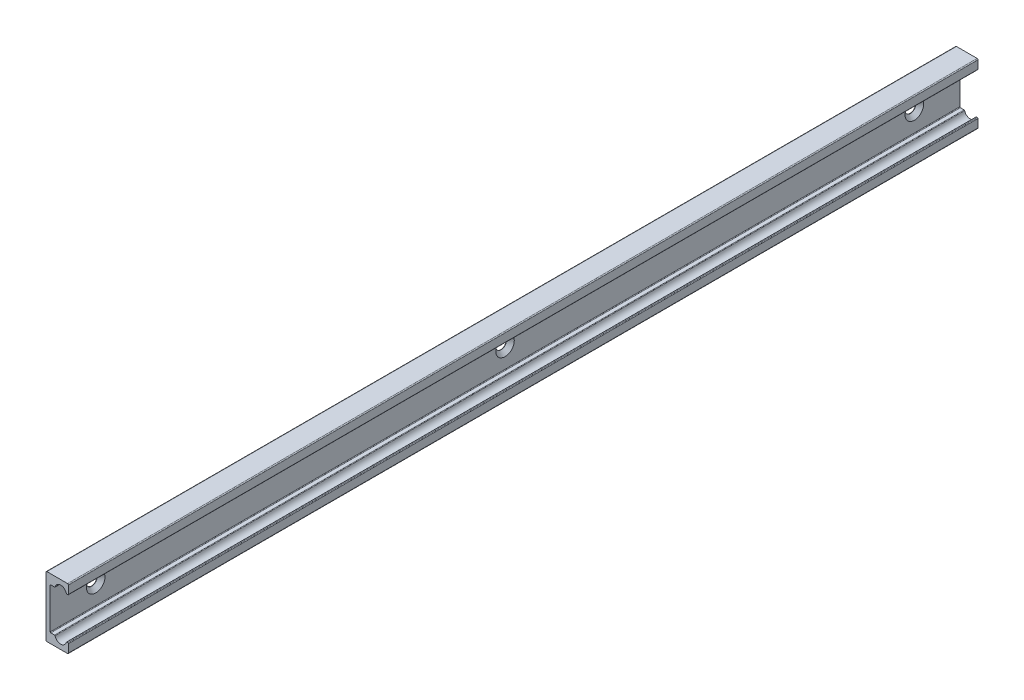
ISO-10303-21;
HEADER;
FILE_DESCRIPTION(('STEP AP214'),'2;1');
FILE_NAME('part.step','',(''),(''),'','','');
FILE_SCHEMA(('AUTOMOTIVE_DESIGN { 1 0 10303 214 1 1 1 1 }'));
ENDSEC;
DATA;
#1=APPLICATION_CONTEXT('core data for automotive mechanical design processes');
#2=APPLICATION_PROTOCOL_DEFINITION('international standard','automotive_design',2000,#1);
#3=PRODUCT_CONTEXT('',#1,'mechanical');
#4=PRODUCT('Part','Part','',(#3));
#5=PRODUCT_RELATED_PRODUCT_CATEGORY('part','',(#4));
#6=PRODUCT_DEFINITION_FORMATION('','',#4);
#7=PRODUCT_DEFINITION_CONTEXT('part definition',#1,'design');
#8=PRODUCT_DEFINITION('design','',#6,#7);
#9=PRODUCT_DEFINITION_SHAPE('','',#8);
#10=(LENGTH_UNIT() NAMED_UNIT(*) SI_UNIT(.MILLI.,.METRE.));
#11=(NAMED_UNIT(*) PLANE_ANGLE_UNIT() SI_UNIT($,.RADIAN.));
#12=(NAMED_UNIT(*) SI_UNIT($,.STERADIAN.) SOLID_ANGLE_UNIT());
#13=UNCERTAINTY_MEASURE_WITH_UNIT(LENGTH_MEASURE(1.E-05),#10,'distance_accuracy_value','');
#14=(GEOMETRIC_REPRESENTATION_CONTEXT(3) GLOBAL_UNCERTAINTY_ASSIGNED_CONTEXT((#13)) GLOBAL_UNIT_ASSIGNED_CONTEXT((#10,
#11,#12)) REPRESENTATION_CONTEXT('',''));
#15=CARTESIAN_POINT('',(0.,0.,0.));
#16=DIRECTION('',(0.,0.,1.));
#17=DIRECTION('',(1.,0.,0.));
#18=AXIS2_PLACEMENT_3D('',#15,#16,#17);
#19=CARTESIAN_POINT('',(-7.1,19.7,300.));
#20=DIRECTION('',(0.,0.,-1.));
#21=DIRECTION('',(-1.,0.,0.));
#22=AXIS2_PLACEMENT_3D('',#19,#20,#21);
#23=CYLINDRICAL_SURFACE('',#22,0.299999999999998);
#24=CARTESIAN_POINT('',(-7.1,19.7,0.));
#25=DIRECTION('',(0.,0.,1.));
#26=DIRECTION('',(1.,0.,0.));
#27=AXIS2_PLACEMENT_3D('',#24,#25,#26);
#28=CIRCLE('',#27,0.299999999999998);
#29=CARTESIAN_POINT('',(-7.1,20.,0.));
#30=VERTEX_POINT('',#29);
#31=CARTESIAN_POINT('',(-7.4,19.7,0.));
#32=VERTEX_POINT('',#31);
#33=EDGE_CURVE('E209',#30,#32,#28,.T.);
#34=ORIENTED_EDGE('',*,*,#33,.T.);
#35=DIRECTION('',(0.,0.,-1.));
#36=VECTOR('',#35,1.);
#37=CARTESIAN_POINT('',(-7.4,19.7,300.));
#38=LINE('',#37,#36);
#39=CARTESIAN_POINT('',(-7.4,19.7,300.));
#40=VERTEX_POINT('',#39);
#41=EDGE_CURVE('E11',#40,#32,#38,.T.);
#42=ORIENTED_EDGE('',*,*,#41,.F.);
#43=CARTESIAN_POINT('',(-7.1,19.7,300.));
#44=DIRECTION('',(0.,0.,1.));
#45=DIRECTION('',(1.,0.,0.));
#46=AXIS2_PLACEMENT_3D('',#43,#44,#45);
#47=CIRCLE('',#46,0.299999999999998);
#48=CARTESIAN_POINT('',(-7.1,20.,300.));
#49=VERTEX_POINT('',#48);
#50=EDGE_CURVE('E264',#49,#40,#47,.T.);
#51=ORIENTED_EDGE('',*,*,#50,.F.);
#52=DIRECTION('',(0.,0.,-1.));
#53=VECTOR('',#52,1.);
#54=CARTESIAN_POINT('',(-7.1,20.,300.));
#55=LINE('',#54,#53);
#56=EDGE_CURVE('E205',#49,#30,#55,.T.);
#57=ORIENTED_EDGE('',*,*,#56,.T.);
#58=EDGE_LOOP('',(#34,#42,#51,#57));
#59=FACE_BOUND('',#58,.T.);
#60=ADVANCED_FACE('F17',(#59),#23,.T.);
#61=CARTESIAN_POINT('',(-7.4,19.7,300.));
#62=DIRECTION('',(1.,0.,0.));
#63=DIRECTION('',(0.,0.,-1.));
#64=AXIS2_PLACEMENT_3D('',#61,#62,#63);
#65=PLANE('',#64);
#66=CARTESIAN_POINT('',(-7.4,10.,150.));
#67=DIRECTION('',(1.,0.,0.));
#68=DIRECTION('',(0.,0.,-1.));
#69=AXIS2_PLACEMENT_3D('',#66,#67,#68);
#70=CIRCLE('',#69,1.75);
#71=CARTESIAN_POINT('',(-7.4,10.,148.25));
#72=VERTEX_POINT('',#71);
#73=EDGE_CURVE('E581',#72,#72,#70,.T.);
#74=ORIENTED_EDGE('',*,*,#73,.T.);
#75=EDGE_LOOP('',(#74));
#76=FACE_BOUND('',#75,.T.);
#77=CARTESIAN_POINT('',(-7.4,10.,285.));
#78=DIRECTION('',(1.,0.,0.));
#79=DIRECTION('',(0.,0.,-1.));
#80=AXIS2_PLACEMENT_3D('',#77,#78,#79);
#81=CIRCLE('',#80,1.75);
#82=CARTESIAN_POINT('',(-7.4,10.,283.25));
#83=VERTEX_POINT('',#82);
#84=EDGE_CURVE('E585',#83,#83,#81,.T.);
#85=ORIENTED_EDGE('',*,*,#84,.T.);
#86=EDGE_LOOP('',(#85));
#87=FACE_BOUND('',#86,.T.);
#88=CARTESIAN_POINT('',(-7.4,10.,15.));
#89=DIRECTION('',(1.,0.,0.));
#90=DIRECTION('',(0.,0.,-1.));
#91=AXIS2_PLACEMENT_3D('',#88,#89,#90);
#92=CIRCLE('',#91,1.75);
#93=CARTESIAN_POINT('',(-7.4,10.,13.25));
#94=VERTEX_POINT('',#93);
#95=EDGE_CURVE('E213',#94,#94,#92,.T.);
#96=ORIENTED_EDGE('',*,*,#95,.T.);
#97=EDGE_LOOP('',(#96));
#98=FACE_BOUND('',#97,.T.);
#99=DIRECTION('',(0.,-1.,0.));
#100=VECTOR('',#99,1.);
#101=CARTESIAN_POINT('',(-7.4,19.7,0.));
#102=LINE('',#101,#100);
#103=CARTESIAN_POINT('',(-7.4,0.300000000000002,0.));
#104=VERTEX_POINT('',#103);
#105=EDGE_CURVE('E212',#32,#104,#102,.T.);
#106=ORIENTED_EDGE('',*,*,#105,.T.);
#107=DIRECTION('',(0.,0.,-1.));
#108=VECTOR('',#107,1.);
#109=CARTESIAN_POINT('',(-7.4,0.300000000000002,300.));
#110=LINE('',#109,#108);
#111=CARTESIAN_POINT('',(-7.4,0.300000000000002,300.));
#112=VERTEX_POINT('',#111);
#113=EDGE_CURVE('E25',#112,#104,#110,.T.);
#114=ORIENTED_EDGE('',*,*,#113,.F.);
#115=DIRECTION('',(0.,-1.,0.));
#116=VECTOR('',#115,1.);
#117=CARTESIAN_POINT('',(-7.4,19.7,300.));
#118=LINE('',#117,#116);
#119=EDGE_CURVE('E124',#40,#112,#118,.T.);
#120=ORIENTED_EDGE('',*,*,#119,.F.);
#121=ORIENTED_EDGE('',*,*,#41,.T.);
#122=EDGE_LOOP('',(#106,#114,#120,#121));
#123=FACE_BOUND('',#122,.T.);
#124=ADVANCED_FACE('F400',(#76,#87,#98,#123),#65,.F.);
#125=CARTESIAN_POINT('',(-7.1,0.299999999999999,300.));
#126=DIRECTION('',(0.,0.,-1.));
#127=DIRECTION('',(-1.,0.,0.));
#128=AXIS2_PLACEMENT_3D('',#125,#126,#127);
#129=CYLINDRICAL_SURFACE('',#128,0.299999999999999);
#130=CARTESIAN_POINT('',(-7.1,0.299999999999999,0.));
#131=DIRECTION('',(0.,0.,1.));
#132=DIRECTION('',(1.,0.,0.));
#133=AXIS2_PLACEMENT_3D('',#130,#131,#132);
#134=CIRCLE('',#133,0.299999999999999);
#135=CARTESIAN_POINT('',(-7.1,0.,0.));
#136=VERTEX_POINT('',#135);
#137=EDGE_CURVE('E215',#104,#136,#134,.T.);
#138=ORIENTED_EDGE('',*,*,#137,.T.);
#139=DIRECTION('',(0.,0.,-1.));
#140=VECTOR('',#139,1.);
#141=CARTESIAN_POINT('',(-7.1,0.,300.));
#142=LINE('',#141,#140);
#143=CARTESIAN_POINT('',(-7.1,0.,300.));
#144=VERTEX_POINT('',#143);
#145=EDGE_CURVE('E311',#144,#136,#142,.T.);
#146=ORIENTED_EDGE('',*,*,#145,.F.);
#147=CARTESIAN_POINT('',(-7.1,0.299999999999999,300.));
#148=DIRECTION('',(0.,0.,1.));
#149=DIRECTION('',(1.,0.,0.));
#150=AXIS2_PLACEMENT_3D('',#147,#148,#149);
#151=CIRCLE('',#150,0.299999999999999);
#152=EDGE_CURVE('E319',#112,#144,#151,.T.);
#153=ORIENTED_EDGE('',*,*,#152,.F.);
#154=ORIENTED_EDGE('',*,*,#113,.T.);
#155=EDGE_LOOP('',(#138,#146,#153,#154));
#156=FACE_BOUND('',#155,.T.);
#157=ADVANCED_FACE('F317',(#156),#129,.T.);
#158=CARTESIAN_POINT('',(-7.1,0.,300.));
#159=DIRECTION('',(0.,1.,0.));
#160=DIRECTION('',(0.,0.,1.));
#161=AXIS2_PLACEMENT_3D('',#158,#159,#160);
#162=PLANE('',#161);
#163=DIRECTION('',(1.,0.,0.));
#164=VECTOR('',#163,1.);
#165=CARTESIAN_POINT('',(-7.1,0.,0.));
#166=LINE('',#165,#164);
#167=CARTESIAN_POINT('',(-0.300000000000001,0.,0.));
#168=VERTEX_POINT('',#167);
#169=EDGE_CURVE('E217',#136,#168,#166,.T.);
#170=ORIENTED_EDGE('',*,*,#169,.T.);
#171=DIRECTION('',(0.,0.,-1.));
#172=VECTOR('',#171,1.);
#173=CARTESIAN_POINT('',(-0.300000000000001,0.,300.));
#174=LINE('',#173,#172);
#175=CARTESIAN_POINT('',(-0.300000000000001,0.,300.));
#176=VERTEX_POINT('',#175);
#177=EDGE_CURVE('E308',#176,#168,#174,.T.);
#178=ORIENTED_EDGE('',*,*,#177,.F.);
#179=DIRECTION('',(1.,0.,0.));
#180=VECTOR('',#179,1.);
#181=CARTESIAN_POINT('',(-7.1,0.,300.));
#182=LINE('',#181,#180);
#183=EDGE_CURVE('E337',#144,#176,#182,.T.);
#184=ORIENTED_EDGE('',*,*,#183,.F.);
#185=ORIENTED_EDGE('',*,*,#145,.T.);
#186=EDGE_LOOP('',(#170,#178,#184,#185));
#187=FACE_BOUND('',#186,.T.);
#188=ADVANCED_FACE('F328',(#187),#162,.F.);
#189=CARTESIAN_POINT('',(-0.3,0.3,300.));
#190=DIRECTION('',(0.,0.,-1.));
#191=DIRECTION('',(-1.,0.,0.));
#192=AXIS2_PLACEMENT_3D('',#189,#190,#191);
#193=CYLINDRICAL_SURFACE('',#192,0.3);
#194=CARTESIAN_POINT('',(-0.3,0.3,0.));
#195=DIRECTION('',(0.,0.,1.));
#196=DIRECTION('',(1.,0.,0.));
#197=AXIS2_PLACEMENT_3D('',#194,#195,#196);
#198=CIRCLE('',#197,0.3);
#199=CARTESIAN_POINT('',(0.,0.3,0.));
#200=VERTEX_POINT('',#199);
#201=EDGE_CURVE('E219',#168,#200,#198,.T.);
#202=ORIENTED_EDGE('',*,*,#201,.T.);
#203=DIRECTION('',(0.,0.,-1.));
#204=VECTOR('',#203,1.);
#205=CARTESIAN_POINT('',(0.,0.3,300.));
#206=LINE('',#205,#204);
#207=CARTESIAN_POINT('',(0.,0.3,300.));
#208=VERTEX_POINT('',#207);
#209=EDGE_CURVE('E305',#208,#200,#206,.T.);
#210=ORIENTED_EDGE('',*,*,#209,.F.);
#211=CARTESIAN_POINT('',(-0.3,0.3,300.));
#212=DIRECTION('',(0.,0.,1.));
#213=DIRECTION('',(1.,0.,0.));
#214=AXIS2_PLACEMENT_3D('',#211,#212,#213);
#215=CIRCLE('',#214,0.3);
#216=EDGE_CURVE('E334',#176,#208,#215,.T.);
#217=ORIENTED_EDGE('',*,*,#216,.F.);
#218=ORIENTED_EDGE('',*,*,#177,.T.);
#219=EDGE_LOOP('',(#202,#210,#217,#218));
#220=FACE_BOUND('',#219,.T.);
#221=ADVANCED_FACE('F332',(#220),#193,.T.);
#222=CARTESIAN_POINT('',(0.,0.3,300.));
#223=DIRECTION('',(-1.,0.,0.));
#224=DIRECTION('',(0.,0.,1.));
#225=AXIS2_PLACEMENT_3D('',#222,#223,#224);
#226=PLANE('',#225);
#227=DIRECTION('',(0.,1.,0.));
#228=VECTOR('',#227,1.);
#229=CARTESIAN_POINT('',(0.,0.3,0.));
#230=LINE('',#229,#228);
#231=CARTESIAN_POINT('',(0.,2.95,0.));
#232=VERTEX_POINT('',#231);
#233=EDGE_CURVE('E221',#200,#232,#230,.T.);
#234=ORIENTED_EDGE('',*,*,#233,.T.);
#235=DIRECTION('',(0.,0.,-1.));
#236=VECTOR('',#235,1.);
#237=CARTESIAN_POINT('',(0.,2.95,300.));
#238=LINE('',#237,#236);
#239=CARTESIAN_POINT('',(0.,2.95,300.));
#240=VERTEX_POINT('',#239);
#241=EDGE_CURVE('E302',#240,#232,#238,.T.);
#242=ORIENTED_EDGE('',*,*,#241,.F.);
#243=DIRECTION('',(0.,1.,0.));
#244=VECTOR('',#243,1.);
#245=CARTESIAN_POINT('',(0.,0.3,300.));
#246=LINE('',#245,#244);
#247=EDGE_CURVE('E336',#208,#240,#246,.T.);
#248=ORIENTED_EDGE('',*,*,#247,.F.);
#249=ORIENTED_EDGE('',*,*,#209,.T.);
#250=EDGE_LOOP('',(#234,#242,#248,#249));
#251=FACE_BOUND('',#250,.T.);
#252=ADVANCED_FACE('F416',(#251),#226,.F.);
#253=CARTESIAN_POINT('',(-0.199999999999999,2.95,300.));
#254=DIRECTION('',(0.,0.,-1.));
#255=DIRECTION('',(-1.,0.,0.));
#256=AXIS2_PLACEMENT_3D('',#253,#254,#255);
#257=CYLINDRICAL_SURFACE('',#256,0.199999999999999);
#258=CARTESIAN_POINT('',(-0.199999999999999,2.95,0.));
#259=DIRECTION('',(0.,0.,1.));
#260=DIRECTION('',(1.,0.,0.));
#261=AXIS2_PLACEMENT_3D('',#258,#259,#260);
#262=CIRCLE('',#261,0.199999999999999);
#263=CARTESIAN_POINT('',(-0.2,3.15,0.));
#264=VERTEX_POINT('',#263);
#265=EDGE_CURVE('E223',#232,#264,#262,.T.);
#266=ORIENTED_EDGE('',*,*,#265,.T.);
#267=DIRECTION('',(0.,0.,-1.));
#268=VECTOR('',#267,1.);
#269=CARTESIAN_POINT('',(-0.2,3.15,300.));
#270=LINE('',#269,#268);
#271=CARTESIAN_POINT('',(-0.2,3.15,300.));
#272=VERTEX_POINT('',#271);
#273=EDGE_CURVE('E299',#272,#264,#270,.T.);
#274=ORIENTED_EDGE('',*,*,#273,.F.);
#275=CARTESIAN_POINT('',(-0.199999999999999,2.95,300.));
#276=DIRECTION('',(0.,0.,1.));
#277=DIRECTION('',(1.,0.,0.));
#278=AXIS2_PLACEMENT_3D('',#275,#276,#277);
#279=CIRCLE('',#278,0.199999999999999);
#280=EDGE_CURVE('E339',#240,#272,#279,.T.);
#281=ORIENTED_EDGE('',*,*,#280,.F.);
#282=ORIENTED_EDGE('',*,*,#241,.T.);
#283=EDGE_LOOP('',(#266,#274,#281,#282));
#284=FACE_BOUND('',#283,.T.);
#285=ADVANCED_FACE('F419',(#284),#257,.T.);
#286=CARTESIAN_POINT('',(-0.2,3.15,300.));
#287=DIRECTION('',(0.,-1.,0.));
#288=DIRECTION('',(0.,0.,-1.));
#289=AXIS2_PLACEMENT_3D('',#286,#287,#288);
#290=PLANE('',#289);
#291=DIRECTION('',(-1.,0.,0.));
#292=VECTOR('',#291,1.);
#293=CARTESIAN_POINT('',(-0.2,3.15,0.));
#294=LINE('',#293,#292);
#295=CARTESIAN_POINT('',(-0.514127950975306,3.15,0.));
#296=VERTEX_POINT('',#295);
#297=EDGE_CURVE('E225',#264,#296,#294,.T.);
#298=ORIENTED_EDGE('',*,*,#297,.T.);
#299=DIRECTION('',(0.,0.,-1.));
#300=VECTOR('',#299,1.);
#301=CARTESIAN_POINT('',(-0.514127950975306,3.15,300.));
#302=LINE('',#301,#300);
#303=CARTESIAN_POINT('',(-0.514127950975306,3.15,300.));
#304=VERTEX_POINT('',#303);
#305=EDGE_CURVE('E296',#304,#296,#302,.T.);
#306=ORIENTED_EDGE('',*,*,#305,.F.);
#307=DIRECTION('',(-1.,0.,0.));
#308=VECTOR('',#307,1.);
#309=CARTESIAN_POINT('',(-0.2,3.15,300.));
#310=LINE('',#309,#308);
#311=EDGE_CURVE('E345',#272,#304,#310,.T.);
#312=ORIENTED_EDGE('',*,*,#311,.F.);
#313=ORIENTED_EDGE('',*,*,#273,.T.);
#314=EDGE_LOOP('',(#298,#306,#312,#313));
#315=FACE_BOUND('',#314,.T.);
#316=ADVANCED_FACE('F423',(#315),#290,.F.);
#317=CARTESIAN_POINT('',(-0.514127950975306,2.95,300.));
#318=DIRECTION('',(0.,0.,-1.));
#319=DIRECTION('',(-1.,0.,0.));
#320=AXIS2_PLACEMENT_3D('',#317,#318,#319);
#321=CYLINDRICAL_SURFACE('',#320,0.2);
#322=CARTESIAN_POINT('',(-0.514127950975306,2.95,0.));
#323=DIRECTION('',(0.,0.,1.));
#324=DIRECTION('',(1.,0.,0.));
#325=AXIS2_PLACEMENT_3D('',#322,#323,#324);
#326=CIRCLE('',#325,0.2);
#327=CARTESIAN_POINT('',(-0.708020527072896,2.99904761904762,0.));
#328=VERTEX_POINT('',#327);
#329=EDGE_CURVE('E227',#296,#328,#326,.T.);
#330=ORIENTED_EDGE('',*,*,#329,.T.);
#331=DIRECTION('',(0.,0.,-1.));
#332=VECTOR('',#331,1.);
#333=CARTESIAN_POINT('',(-0.708020527072896,2.99904761904762,300.));
#334=LINE('',#333,#332);
#335=CARTESIAN_POINT('',(-0.708020527072896,2.99904761904762,300.));
#336=VERTEX_POINT('',#335);
#337=EDGE_CURVE('E294',#336,#328,#334,.T.);
#338=ORIENTED_EDGE('',*,*,#337,.F.);
#339=CARTESIAN_POINT('',(-0.514127950975306,2.95,300.));
#340=DIRECTION('',(0.,0.,1.));
#341=DIRECTION('',(1.,0.,0.));
#342=AXIS2_PLACEMENT_3D('',#339,#340,#341);
#343=CIRCLE('',#342,0.2);
#344=EDGE_CURVE('E347',#304,#336,#343,.T.);
#345=ORIENTED_EDGE('',*,*,#344,.F.);
#346=ORIENTED_EDGE('',*,*,#305,.T.);
#347=EDGE_LOOP('',(#330,#338,#345,#346));
#348=FACE_BOUND('',#347,.T.);
#349=ADVANCED_FACE('F427',(#348),#321,.T.);
#350=CARTESIAN_POINT('',(-2.55,3.46499999999999,300.));
#351=DIRECTION('',(0.,0.,-1.));
#352=DIRECTION('',(-1.,0.,0.));
#353=AXIS2_PLACEMENT_3D('',#350,#351,#352);
#354=CYLINDRICAL_SURFACE('',#353,1.9);
#355=CARTESIAN_POINT('',(-2.55,3.46499999999999,0.));
#356=DIRECTION('',(0.,0.,1.));
#357=DIRECTION('',(1.,0.,0.));
#358=AXIS2_PLACEMENT_3D('',#355,#356,#357);
#359=CIRCLE('',#358,1.9);
#360=CARTESIAN_POINT('',(-4.3919794729271,2.99904761904762,0.));
#361=VERTEX_POINT('',#360);
#362=EDGE_CURVE('E230',#361,#328,#359,.T.);
#363=ORIENTED_EDGE('',*,*,#362,.F.);
#364=DIRECTION('',(0.,0.,-1.));
#365=VECTOR('',#364,1.);
#366=CARTESIAN_POINT('',(-4.3919794729271,2.99904761904762,300.));
#367=LINE('',#366,#365);
#368=CARTESIAN_POINT('',(-4.3919794729271,2.99904761904762,300.));
#369=VERTEX_POINT('',#368);
#370=EDGE_CURVE('E292',#369,#361,#367,.T.);
#371=ORIENTED_EDGE('',*,*,#370,.F.);
#372=CARTESIAN_POINT('',(-2.55,3.46499999999999,300.));
#373=DIRECTION('',(0.,0.,1.));
#374=DIRECTION('',(1.,0.,0.));
#375=AXIS2_PLACEMENT_3D('',#372,#373,#374);
#376=CIRCLE('',#375,1.9);
#377=EDGE_CURVE('E349',#369,#336,#376,.T.);
#378=ORIENTED_EDGE('',*,*,#377,.T.);
#379=ORIENTED_EDGE('',*,*,#337,.T.);
#380=EDGE_LOOP('',(#363,#371,#378,#379));
#381=FACE_BOUND('',#380,.T.);
#382=ADVANCED_FACE('F431',(#381),#354,.F.);
#383=CARTESIAN_POINT('',(-4.58587204902469,2.95,300.));
#384=DIRECTION('',(0.,0.,-1.));
#385=DIRECTION('',(-1.,0.,0.));
#386=AXIS2_PLACEMENT_3D('',#383,#384,#385);
#387=CYLINDRICAL_SURFACE('',#386,0.2);
#388=CARTESIAN_POINT('',(-4.58587204902469,2.95,0.));
#389=DIRECTION('',(0.,0.,1.));
#390=DIRECTION('',(1.,0.,0.));
#391=AXIS2_PLACEMENT_3D('',#388,#389,#390);
#392=CIRCLE('',#391,0.2);
#393=CARTESIAN_POINT('',(-4.58587204902469,3.15,0.));
#394=VERTEX_POINT('',#393);
#395=EDGE_CURVE('E233',#361,#394,#392,.T.);
#396=ORIENTED_EDGE('',*,*,#395,.T.);
#397=DIRECTION('',(0.,0.,-1.));
#398=VECTOR('',#397,1.);
#399=CARTESIAN_POINT('',(-4.58587204902469,3.15,300.));
#400=LINE('',#399,#398);
#401=CARTESIAN_POINT('',(-4.58587204902469,3.15,300.));
#402=VERTEX_POINT('',#401);
#403=EDGE_CURVE('E289',#402,#394,#400,.T.);
#404=ORIENTED_EDGE('',*,*,#403,.F.);
#405=CARTESIAN_POINT('',(-4.58587204902469,2.95,300.));
#406=DIRECTION('',(0.,0.,1.));
#407=DIRECTION('',(1.,0.,0.));
#408=AXIS2_PLACEMENT_3D('',#405,#406,#407);
#409=CIRCLE('',#408,0.2);
#410=EDGE_CURVE('E352',#369,#402,#409,.T.);
#411=ORIENTED_EDGE('',*,*,#410,.F.);
#412=ORIENTED_EDGE('',*,*,#370,.T.);
#413=EDGE_LOOP('',(#396,#404,#411,#412));
#414=FACE_BOUND('',#413,.T.);
#415=ADVANCED_FACE('F435',(#414),#387,.T.);
#416=CARTESIAN_POINT('',(-4.58587204902469,3.15,300.));
#417=DIRECTION('',(0.,-1.,0.));
#418=DIRECTION('',(0.,0.,-1.));
#419=AXIS2_PLACEMENT_3D('',#416,#417,#418);
#420=PLANE('',#419);
#421=DIRECTION('',(-1.,0.,0.));
#422=VECTOR('',#421,1.);
#423=CARTESIAN_POINT('',(-4.58587204902469,3.15,0.));
#424=LINE('',#423,#422);
#425=CARTESIAN_POINT('',(-5.8,3.15,0.));
#426=VERTEX_POINT('',#425);
#427=EDGE_CURVE('E235',#394,#426,#424,.T.);
#428=ORIENTED_EDGE('',*,*,#427,.T.);
#429=DIRECTION('',(0.,0.,-1.));
#430=VECTOR('',#429,1.);
#431=CARTESIAN_POINT('',(-5.8,3.15,300.));
#432=LINE('',#431,#430);
#433=CARTESIAN_POINT('',(-5.8,3.15,300.));
#434=VERTEX_POINT('',#433);
#435=EDGE_CURVE('E287',#434,#426,#432,.T.);
#436=ORIENTED_EDGE('',*,*,#435,.F.);
#437=DIRECTION('',(-1.,0.,0.));
#438=VECTOR('',#437,1.);
#439=CARTESIAN_POINT('',(-4.58587204902469,3.15,300.));
#440=LINE('',#439,#438);
#441=EDGE_CURVE('E354',#402,#434,#440,.T.);
#442=ORIENTED_EDGE('',*,*,#441,.F.);
#443=ORIENTED_EDGE('',*,*,#403,.T.);
#444=EDGE_LOOP('',(#428,#436,#442,#443));
#445=FACE_BOUND('',#444,.T.);
#446=ADVANCED_FACE('F439',(#445),#420,.F.);
#447=CARTESIAN_POINT('',(-5.8,3.35,300.));
#448=DIRECTION('',(0.,0.,-1.));
#449=DIRECTION('',(-1.,0.,0.));
#450=AXIS2_PLACEMENT_3D('',#447,#448,#449);
#451=CYLINDRICAL_SURFACE('',#450,0.2);
#452=CARTESIAN_POINT('',(-5.8,3.35,0.));
#453=DIRECTION('',(0.,0.,1.));
#454=DIRECTION('',(1.,0.,0.));
#455=AXIS2_PLACEMENT_3D('',#452,#453,#454);
#456=CIRCLE('',#455,0.2);
#457=CARTESIAN_POINT('',(-6.,3.35,0.));
#458=VERTEX_POINT('',#457);
#459=EDGE_CURVE('E238',#458,#426,#456,.T.);
#460=ORIENTED_EDGE('',*,*,#459,.F.);
#461=DIRECTION('',(0.,0.,-1.));
#462=VECTOR('',#461,1.);
#463=CARTESIAN_POINT('',(-6.,3.35,300.));
#464=LINE('',#463,#462);
#465=CARTESIAN_POINT('',(-6.,3.35,300.));
#466=VERTEX_POINT('',#465);
#467=EDGE_CURVE('E285',#466,#458,#464,.T.);
#468=ORIENTED_EDGE('',*,*,#467,.F.);
#469=CARTESIAN_POINT('',(-5.8,3.35,300.));
#470=DIRECTION('',(0.,0.,1.));
#471=DIRECTION('',(1.,0.,0.));
#472=AXIS2_PLACEMENT_3D('',#469,#470,#471);
#473=CIRCLE('',#472,0.2);
#474=EDGE_CURVE('E356',#466,#434,#473,.T.);
#475=ORIENTED_EDGE('',*,*,#474,.T.);
#476=ORIENTED_EDGE('',*,*,#435,.T.);
#477=EDGE_LOOP('',(#460,#468,#475,#476));
#478=FACE_BOUND('',#477,.T.);
#479=ADVANCED_FACE('F443',(#478),#451,.F.);
#480=CARTESIAN_POINT('',(-6.,3.35,300.));
#481=DIRECTION('',(-1.,0.,0.));
#482=DIRECTION('',(0.,0.,1.));
#483=AXIS2_PLACEMENT_3D('',#480,#481,#482);
#484=PLANE('',#483);
#485=CARTESIAN_POINT('',(-6.,10.,150.));
#486=DIRECTION('',(1.,0.,0.));
#487=DIRECTION('',(0.,0.,-1.));
#488=AXIS2_PLACEMENT_3D('',#485,#486,#487);
#489=CIRCLE('',#488,3.05);
#490=CARTESIAN_POINT('',(-6.,10.,146.95));
#491=VERTEX_POINT('',#490);
#492=EDGE_CURVE('E577',#491,#491,#489,.T.);
#493=ORIENTED_EDGE('',*,*,#492,.F.);
#494=EDGE_LOOP('',(#493));
#495=FACE_BOUND('',#494,.T.);
#496=CARTESIAN_POINT('',(-6.,10.,285.));
#497=DIRECTION('',(1.,0.,0.));
#498=DIRECTION('',(0.,0.,-1.));
#499=AXIS2_PLACEMENT_3D('',#496,#497,#498);
#500=CIRCLE('',#499,3.05);
#501=CARTESIAN_POINT('',(-6.,10.,281.95));
#502=VERTEX_POINT('',#501);
#503=EDGE_CURVE('E588',#502,#502,#500,.T.);
#504=ORIENTED_EDGE('',*,*,#503,.F.);
#505=EDGE_LOOP('',(#504));
#506=FACE_BOUND('',#505,.T.);
#507=CARTESIAN_POINT('',(-6.,10.,15.));
#508=DIRECTION('',(1.,0.,0.));
#509=DIRECTION('',(0.,0.,-1.));
#510=AXIS2_PLACEMENT_3D('',#507,#508,#509);
#511=CIRCLE('',#510,3.05);
#512=CARTESIAN_POINT('',(-6.,10.,11.95));
#513=VERTEX_POINT('',#512);
#514=EDGE_CURVE('E583',#513,#513,#511,.T.);
#515=ORIENTED_EDGE('',*,*,#514,.F.);
#516=EDGE_LOOP('',(#515));
#517=FACE_BOUND('',#516,.T.);
#518=DIRECTION('',(0.,1.,0.));
#519=VECTOR('',#518,1.);
#520=CARTESIAN_POINT('',(-6.,3.35,0.));
#521=LINE('',#520,#519);
#522=CARTESIAN_POINT('',(-6.,16.65,0.));
#523=VERTEX_POINT('',#522);
#524=EDGE_CURVE('E241',#458,#523,#521,.T.);
#525=ORIENTED_EDGE('',*,*,#524,.T.);
#526=DIRECTION('',(0.,0.,-1.));
#527=VECTOR('',#526,1.);
#528=CARTESIAN_POINT('',(-6.,16.65,300.));
#529=LINE('',#528,#527);
#530=CARTESIAN_POINT('',(-6.,16.65,300.));
#531=VERTEX_POINT('',#530);
#532=EDGE_CURVE('E283',#531,#523,#529,.T.);
#533=ORIENTED_EDGE('',*,*,#532,.F.);
#534=DIRECTION('',(0.,1.,0.));
#535=VECTOR('',#534,1.);
#536=CARTESIAN_POINT('',(-6.,3.35,300.));
#537=LINE('',#536,#535);
#538=EDGE_CURVE('E359',#466,#531,#537,.T.);
#539=ORIENTED_EDGE('',*,*,#538,.F.);
#540=ORIENTED_EDGE('',*,*,#467,.T.);
#541=EDGE_LOOP('',(#525,#533,#539,#540));
#542=FACE_BOUND('',#541,.T.);
#543=ADVANCED_FACE('F447',(#495,#506,#517,#542),#484,.F.);
#544=CARTESIAN_POINT('',(-5.8,16.65,300.));
#545=DIRECTION('',(0.,0.,-1.));
#546=DIRECTION('',(-1.,0.,0.));
#547=AXIS2_PLACEMENT_3D('',#544,#545,#546);
#548=CYLINDRICAL_SURFACE('',#547,0.199999999999997);
#549=CARTESIAN_POINT('',(-5.8,16.65,0.));
#550=DIRECTION('',(0.,0.,1.));
#551=DIRECTION('',(1.,0.,0.));
#552=AXIS2_PLACEMENT_3D('',#549,#550,#551);
#553=CIRCLE('',#552,0.199999999999997);
#554=CARTESIAN_POINT('',(-5.8,16.85,0.));
#555=VERTEX_POINT('',#554);
#556=EDGE_CURVE('E244',#555,#523,#553,.T.);
#557=ORIENTED_EDGE('',*,*,#556,.F.);
#558=DIRECTION('',(0.,0.,-1.));
#559=VECTOR('',#558,1.);
#560=CARTESIAN_POINT('',(-5.8,16.85,300.));
#561=LINE('',#560,#559);
#562=CARTESIAN_POINT('',(-5.8,16.85,300.));
#563=VERTEX_POINT('',#562);
#564=EDGE_CURVE('E281',#563,#555,#561,.T.);
#565=ORIENTED_EDGE('',*,*,#564,.F.);
#566=CARTESIAN_POINT('',(-5.8,16.65,300.));
#567=DIRECTION('',(0.,0.,1.));
#568=DIRECTION('',(1.,0.,0.));
#569=AXIS2_PLACEMENT_3D('',#566,#567,#568);
#570=CIRCLE('',#569,0.199999999999997);
#571=EDGE_CURVE('E361',#563,#531,#570,.T.);
#572=ORIENTED_EDGE('',*,*,#571,.T.);
#573=ORIENTED_EDGE('',*,*,#532,.T.);
#574=EDGE_LOOP('',(#557,#565,#572,#573));
#575=FACE_BOUND('',#574,.T.);
#576=ADVANCED_FACE('F451',(#575),#548,.F.);
#577=CARTESIAN_POINT('',(-5.8,16.85,300.));
#578=DIRECTION('',(0.,1.,0.));
#579=DIRECTION('',(0.,0.,1.));
#580=AXIS2_PLACEMENT_3D('',#577,#578,#579);
#581=PLANE('',#580);
#582=DIRECTION('',(1.,0.,0.));
#583=VECTOR('',#582,1.);
#584=CARTESIAN_POINT('',(-5.8,16.85,0.));
#585=LINE('',#584,#583);
#586=CARTESIAN_POINT('',(-4.58587204902469,16.85,0.));
#587=VERTEX_POINT('',#586);
#588=EDGE_CURVE('E247',#555,#587,#585,.T.);
#589=ORIENTED_EDGE('',*,*,#588,.T.);
#590=DIRECTION('',(0.,0.,-1.));
#591=VECTOR('',#590,1.);
#592=CARTESIAN_POINT('',(-4.58587204902469,16.85,300.));
#593=LINE('',#592,#591);
#594=CARTESIAN_POINT('',(-4.58587204902469,16.85,300.));
#595=VERTEX_POINT('',#594);
#596=EDGE_CURVE('E278',#595,#587,#593,.T.);
#597=ORIENTED_EDGE('',*,*,#596,.F.);
#598=DIRECTION('',(1.,0.,0.));
#599=VECTOR('',#598,1.);
#600=CARTESIAN_POINT('',(-5.8,16.85,300.));
#601=LINE('',#600,#599);
#602=EDGE_CURVE('E364',#563,#595,#601,.T.);
#603=ORIENTED_EDGE('',*,*,#602,.F.);
#604=ORIENTED_EDGE('',*,*,#564,.T.);
#605=EDGE_LOOP('',(#589,#597,#603,#604));
#606=FACE_BOUND('',#605,.T.);
#607=ADVANCED_FACE('F455',(#606),#581,.F.);
#608=CARTESIAN_POINT('',(-4.58587204902469,17.05,300.));
#609=DIRECTION('',(0.,0.,-1.));
#610=DIRECTION('',(-1.,0.,0.));
#611=AXIS2_PLACEMENT_3D('',#608,#609,#610);
#612=CYLINDRICAL_SURFACE('',#611,0.200000000000002);
#613=CARTESIAN_POINT('',(-4.58587204902469,17.05,0.));
#614=DIRECTION('',(0.,0.,1.));
#615=DIRECTION('',(1.,0.,0.));
#616=AXIS2_PLACEMENT_3D('',#613,#614,#615);
#617=CIRCLE('',#616,0.200000000000002);
#618=CARTESIAN_POINT('',(-4.3919794729271,17.0009523809524,0.));
#619=VERTEX_POINT('',#618);
#620=EDGE_CURVE('E249',#587,#619,#617,.T.);
#621=ORIENTED_EDGE('',*,*,#620,.T.);
#622=DIRECTION('',(0.,0.,-1.));
#623=VECTOR('',#622,1.);
#624=CARTESIAN_POINT('',(-4.3919794729271,17.0009523809524,300.));
#625=LINE('',#624,#623);
#626=CARTESIAN_POINT('',(-4.3919794729271,17.0009523809524,300.));
#627=VERTEX_POINT('',#626);
#628=EDGE_CURVE('E276',#627,#619,#625,.T.);
#629=ORIENTED_EDGE('',*,*,#628,.F.);
#630=CARTESIAN_POINT('',(-4.58587204902469,17.05,300.));
#631=DIRECTION('',(0.,0.,1.));
#632=DIRECTION('',(1.,0.,0.));
#633=AXIS2_PLACEMENT_3D('',#630,#631,#632);
#634=CIRCLE('',#633,0.200000000000002);
#635=EDGE_CURVE('E366',#595,#627,#634,.T.);
#636=ORIENTED_EDGE('',*,*,#635,.F.);
#637=ORIENTED_EDGE('',*,*,#596,.T.);
#638=EDGE_LOOP('',(#621,#629,#636,#637));
#639=FACE_BOUND('',#638,.T.);
#640=ADVANCED_FACE('F459',(#639),#612,.T.);
#641=CARTESIAN_POINT('',(-2.55,16.535,300.));
#642=DIRECTION('',(0.,0.,-1.));
#643=DIRECTION('',(-1.,0.,0.));
#644=AXIS2_PLACEMENT_3D('',#641,#642,#643);
#645=CYLINDRICAL_SURFACE('',#644,1.9);
#646=CARTESIAN_POINT('',(-2.55,16.535,0.));
#647=DIRECTION('',(0.,0.,1.));
#648=DIRECTION('',(1.,0.,0.));
#649=AXIS2_PLACEMENT_3D('',#646,#647,#648);
#650=CIRCLE('',#649,1.9);
#651=CARTESIAN_POINT('',(-0.708020527072897,17.0009523809524,0.));
#652=VERTEX_POINT('',#651);
#653=EDGE_CURVE('E252',#652,#619,#650,.T.);
#654=ORIENTED_EDGE('',*,*,#653,.F.);
#655=DIRECTION('',(0.,0.,-1.));
#656=VECTOR('',#655,1.);
#657=CARTESIAN_POINT('',(-0.708020527072897,17.0009523809524,300.));
#658=LINE('',#657,#656);
#659=CARTESIAN_POINT('',(-0.708020527072897,17.0009523809524,300.));
#660=VERTEX_POINT('',#659);
#661=EDGE_CURVE('E274',#660,#652,#658,.T.);
#662=ORIENTED_EDGE('',*,*,#661,.F.);
#663=CARTESIAN_POINT('',(-2.55,16.535,300.));
#664=DIRECTION('',(0.,0.,1.));
#665=DIRECTION('',(1.,0.,0.));
#666=AXIS2_PLACEMENT_3D('',#663,#664,#665);
#667=CIRCLE('',#666,1.9);
#668=EDGE_CURVE('E368',#660,#627,#667,.T.);
#669=ORIENTED_EDGE('',*,*,#668,.T.);
#670=ORIENTED_EDGE('',*,*,#628,.T.);
#671=EDGE_LOOP('',(#654,#662,#669,#670));
#672=FACE_BOUND('',#671,.T.);
#673=ADVANCED_FACE('F463',(#672),#645,.F.);
#674=CARTESIAN_POINT('',(-0.514127950975306,17.05,300.));
#675=DIRECTION('',(0.,0.,-1.));
#676=DIRECTION('',(-1.,0.,0.));
#677=AXIS2_PLACEMENT_3D('',#674,#675,#676);
#678=CYLINDRICAL_SURFACE('',#677,0.200000000000002);
#679=CARTESIAN_POINT('',(-0.514127950975306,17.05,0.));
#680=DIRECTION('',(0.,0.,1.));
#681=DIRECTION('',(1.,0.,0.));
#682=AXIS2_PLACEMENT_3D('',#679,#680,#681);
#683=CIRCLE('',#682,0.200000000000002);
#684=CARTESIAN_POINT('',(-0.514127950975306,16.85,0.));
#685=VERTEX_POINT('',#684);
#686=EDGE_CURVE('E255',#652,#685,#683,.T.);
#687=ORIENTED_EDGE('',*,*,#686,.T.);
#688=DIRECTION('',(0.,0.,-1.));
#689=VECTOR('',#688,1.);
#690=CARTESIAN_POINT('',(-0.514127950975306,16.85,300.));
#691=LINE('',#690,#689);
#692=CARTESIAN_POINT('',(-0.514127950975306,16.85,300.));
#693=VERTEX_POINT('',#692);
#694=EDGE_CURVE('E271',#693,#685,#691,.T.);
#695=ORIENTED_EDGE('',*,*,#694,.F.);
#696=CARTESIAN_POINT('',(-0.514127950975306,17.05,300.));
#697=DIRECTION('',(0.,0.,1.));
#698=DIRECTION('',(1.,0.,0.));
#699=AXIS2_PLACEMENT_3D('',#696,#697,#698);
#700=CIRCLE('',#699,0.200000000000002);
#701=EDGE_CURVE('E371',#660,#693,#700,.T.);
#702=ORIENTED_EDGE('',*,*,#701,.F.);
#703=ORIENTED_EDGE('',*,*,#661,.T.);
#704=EDGE_LOOP('',(#687,#695,#702,#703));
#705=FACE_BOUND('',#704,.T.);
#706=ADVANCED_FACE('F467',(#705),#678,.T.);
#707=CARTESIAN_POINT('',(-0.514127950975306,16.85,300.));
#708=DIRECTION('',(0.,1.,0.));
#709=DIRECTION('',(0.,0.,1.));
#710=AXIS2_PLACEMENT_3D('',#707,#708,#709);
#711=PLANE('',#710);
#712=DIRECTION('',(1.,0.,0.));
#713=VECTOR('',#712,1.);
#714=CARTESIAN_POINT('',(-0.514127950975306,16.85,0.));
#715=LINE('',#714,#713);
#716=CARTESIAN_POINT('',(-0.2,16.85,0.));
#717=VERTEX_POINT('',#716);
#718=EDGE_CURVE('E257',#685,#717,#715,.T.);
#719=ORIENTED_EDGE('',*,*,#718,.T.);
#720=DIRECTION('',(0.,0.,-1.));
#721=VECTOR('',#720,1.);
#722=CARTESIAN_POINT('',(-0.2,16.85,300.));
#723=LINE('',#722,#721);
#724=CARTESIAN_POINT('',(-0.2,16.85,300.));
#725=VERTEX_POINT('',#724);
#726=EDGE_CURVE('E268',#725,#717,#723,.T.);
#727=ORIENTED_EDGE('',*,*,#726,.F.);
#728=DIRECTION('',(1.,0.,0.));
#729=VECTOR('',#728,1.);
#730=CARTESIAN_POINT('',(-0.514127950975306,16.85,300.));
#731=LINE('',#730,#729);
#732=EDGE_CURVE('E373',#693,#725,#731,.T.);
#733=ORIENTED_EDGE('',*,*,#732,.F.);
#734=ORIENTED_EDGE('',*,*,#694,.T.);
#735=EDGE_LOOP('',(#719,#727,#733,#734));
#736=FACE_BOUND('',#735,.T.);
#737=ADVANCED_FACE('F380',(#736),#711,.F.);
#738=CARTESIAN_POINT('',(-0.200000000000009,17.05,300.));
#739=DIRECTION('',(0.,0.,-1.));
#740=DIRECTION('',(-1.,0.,0.));
#741=AXIS2_PLACEMENT_3D('',#738,#739,#740);
#742=CYLINDRICAL_SURFACE('',#741,0.200000000000009);
#743=CARTESIAN_POINT('',(-0.200000000000009,17.05,0.));
#744=DIRECTION('',(0.,0.,1.));
#745=DIRECTION('',(1.,0.,0.));
#746=AXIS2_PLACEMENT_3D('',#743,#744,#745);
#747=CIRCLE('',#746,0.200000000000009);
#748=CARTESIAN_POINT('',(0.,17.05,0.));
#749=VERTEX_POINT('',#748);
#750=EDGE_CURVE('E259',#717,#749,#747,.T.);
#751=ORIENTED_EDGE('',*,*,#750,.T.);
#752=DIRECTION('',(0.,0.,-1.));
#753=VECTOR('',#752,1.);
#754=CARTESIAN_POINT('',(0.,17.05,300.));
#755=LINE('',#754,#753);
#756=CARTESIAN_POINT('',(0.,17.05,300.));
#757=VERTEX_POINT('',#756);
#758=EDGE_CURVE('E200',#757,#749,#755,.T.);
#759=ORIENTED_EDGE('',*,*,#758,.F.);
#760=CARTESIAN_POINT('',(-0.200000000000009,17.05,300.));
#761=DIRECTION('',(0.,0.,1.));
#762=DIRECTION('',(1.,0.,0.));
#763=AXIS2_PLACEMENT_3D('',#760,#761,#762);
#764=CIRCLE('',#763,0.200000000000009);
#765=EDGE_CURVE('E191',#725,#757,#764,.T.);
#766=ORIENTED_EDGE('',*,*,#765,.F.);
#767=ORIENTED_EDGE('',*,*,#726,.T.);
#768=EDGE_LOOP('',(#751,#759,#766,#767));
#769=FACE_BOUND('',#768,.T.);
#770=ADVANCED_FACE('F384',(#769),#742,.T.);
#771=CARTESIAN_POINT('',(0.,17.05,300.));
#772=DIRECTION('',(-1.,0.,0.));
#773=DIRECTION('',(0.,0.,1.));
#774=AXIS2_PLACEMENT_3D('',#771,#772,#773);
#775=PLANE('',#774);
#776=DIRECTION('',(0.,1.,0.));
#777=VECTOR('',#776,1.);
#778=CARTESIAN_POINT('',(0.,17.05,0.));
#779=LINE('',#778,#777);
#780=CARTESIAN_POINT('',(0.,19.7,0.));
#781=VERTEX_POINT('',#780);
#782=EDGE_CURVE('E199',#749,#781,#779,.T.);
#783=ORIENTED_EDGE('',*,*,#782,.T.);
#784=DIRECTION('',(0.,0.,-1.));
#785=VECTOR('',#784,1.);
#786=CARTESIAN_POINT('',(0.,19.7,300.));
#787=LINE('',#786,#785);
#788=CARTESIAN_POINT('',(0.,19.7,300.));
#789=VERTEX_POINT('',#788);
#790=EDGE_CURVE('E196',#789,#781,#787,.T.);
#791=ORIENTED_EDGE('',*,*,#790,.F.);
#792=DIRECTION('',(0.,1.,0.));
#793=VECTOR('',#792,1.);
#794=CARTESIAN_POINT('',(0.,17.05,300.));
#795=LINE('',#794,#793);
#796=EDGE_CURVE('E185',#757,#789,#795,.T.);
#797=ORIENTED_EDGE('',*,*,#796,.F.);
#798=ORIENTED_EDGE('',*,*,#758,.T.);
#799=EDGE_LOOP('',(#783,#791,#797,#798));
#800=FACE_BOUND('',#799,.T.);
#801=ADVANCED_FACE('F197',(#800),#775,.F.);
#802=CARTESIAN_POINT('',(-0.299999999999992,19.7,300.));
#803=DIRECTION('',(0.,0.,-1.));
#804=DIRECTION('',(-1.,0.,0.));
#805=AXIS2_PLACEMENT_3D('',#802,#803,#804);
#806=CYLINDRICAL_SURFACE('',#805,0.299999999999992);
#807=CARTESIAN_POINT('',(-0.299999999999992,19.7,0.));
#808=DIRECTION('',(0.,0.,1.));
#809=DIRECTION('',(1.,0.,0.));
#810=AXIS2_PLACEMENT_3D('',#807,#808,#809);
#811=CIRCLE('',#810,0.299999999999992);
#812=CARTESIAN_POINT('',(-0.3,20.,0.));
#813=VERTEX_POINT('',#812);
#814=EDGE_CURVE('E110',#781,#813,#811,.T.);
#815=ORIENTED_EDGE('',*,*,#814,.T.);
#816=DIRECTION('',(0.,0.,-1.));
#817=VECTOR('',#816,1.);
#818=CARTESIAN_POINT('',(-0.3,20.,300.));
#819=LINE('',#818,#817);
#820=CARTESIAN_POINT('',(-0.3,20.,300.));
#821=VERTEX_POINT('',#820);
#822=EDGE_CURVE('E201',#821,#813,#819,.T.);
#823=ORIENTED_EDGE('',*,*,#822,.F.);
#824=CARTESIAN_POINT('',(-0.299999999999992,19.7,300.));
#825=DIRECTION('',(0.,0.,1.));
#826=DIRECTION('',(1.,0.,0.));
#827=AXIS2_PLACEMENT_3D('',#824,#825,#826);
#828=CIRCLE('',#827,0.299999999999992);
#829=EDGE_CURVE('E189',#789,#821,#828,.T.);
#830=ORIENTED_EDGE('',*,*,#829,.F.);
#831=ORIENTED_EDGE('',*,*,#790,.T.);
#832=EDGE_LOOP('',(#815,#823,#830,#831));
#833=FACE_BOUND('',#832,.T.);
#834=ADVANCED_FACE('F203',(#833),#806,.T.);
#835=CARTESIAN_POINT('',(-0.3,20.,300.));
#836=DIRECTION('',(0.,-1.,0.));
#837=DIRECTION('',(0.,0.,-1.));
#838=AXIS2_PLACEMENT_3D('',#835,#836,#837);
#839=PLANE('',#838);
#840=DIRECTION('',(-1.,0.,0.));
#841=VECTOR('',#840,1.);
#842=CARTESIAN_POINT('',(-0.3,20.,0.));
#843=LINE('',#842,#841);
#844=EDGE_CURVE('E116',#813,#30,#843,.T.);
#845=ORIENTED_EDGE('',*,*,#844,.T.);
#846=ORIENTED_EDGE('',*,*,#56,.F.);
#847=DIRECTION('',(-1.,0.,0.));
#848=VECTOR('',#847,1.);
#849=CARTESIAN_POINT('',(-0.3,20.,300.));
#850=LINE('',#849,#848);
#851=EDGE_CURVE('E33',#821,#49,#850,.T.);
#852=ORIENTED_EDGE('',*,*,#851,.F.);
#853=ORIENTED_EDGE('',*,*,#822,.T.);
#854=EDGE_LOOP('',(#845,#846,#852,#853));
#855=FACE_BOUND('',#854,.T.);
#856=ADVANCED_FACE('F388',(#855),#839,.F.);
#857=CARTESIAN_POINT('',(-7.1,19.7,300.));
#858=DIRECTION('',(0.,0.,1.));
#859=DIRECTION('',(1.,0.,0.));
#860=AXIS2_PLACEMENT_3D('',#857,#858,#859);
#861=PLANE('',#860);
#862=ORIENTED_EDGE('',*,*,#50,.T.);
#863=ORIENTED_EDGE('',*,*,#119,.T.);
#864=ORIENTED_EDGE('',*,*,#152,.T.);
#865=ORIENTED_EDGE('',*,*,#183,.T.);
#866=ORIENTED_EDGE('',*,*,#216,.T.);
#867=ORIENTED_EDGE('',*,*,#247,.T.);
#868=ORIENTED_EDGE('',*,*,#280,.T.);
#869=ORIENTED_EDGE('',*,*,#311,.T.);
#870=ORIENTED_EDGE('',*,*,#344,.T.);
#871=ORIENTED_EDGE('',*,*,#377,.F.);
#872=ORIENTED_EDGE('',*,*,#410,.T.);
#873=ORIENTED_EDGE('',*,*,#441,.T.);
#874=ORIENTED_EDGE('',*,*,#474,.F.);
#875=ORIENTED_EDGE('',*,*,#538,.T.);
#876=ORIENTED_EDGE('',*,*,#571,.F.);
#877=ORIENTED_EDGE('',*,*,#602,.T.);
#878=ORIENTED_EDGE('',*,*,#635,.T.);
#879=ORIENTED_EDGE('',*,*,#668,.F.);
#880=ORIENTED_EDGE('',*,*,#701,.T.);
#881=ORIENTED_EDGE('',*,*,#732,.T.);
#882=ORIENTED_EDGE('',*,*,#765,.T.);
#883=ORIENTED_EDGE('',*,*,#796,.T.);
#884=ORIENTED_EDGE('',*,*,#829,.T.);
#885=ORIENTED_EDGE('',*,*,#851,.T.);
#886=EDGE_LOOP('',(#862,#863,#864,#865,#866,#867,#868,#869,#870,#871,#872,#873,#874,#875,#876,
#877,#878,#879,#880,#881,#882,#883,#884,#885));
#887=FACE_BOUND('',#886,.T.);
#888=ADVANCED_FACE('F187',(#887),#861,.T.);
#889=CARTESIAN_POINT('',(-7.1,19.7,0.));
#890=DIRECTION('',(0.,0.,1.));
#891=DIRECTION('',(1.,0.,0.));
#892=AXIS2_PLACEMENT_3D('',#889,#890,#891);
#893=PLANE('',#892);
#894=ORIENTED_EDGE('',*,*,#33,.F.);
#895=ORIENTED_EDGE('',*,*,#844,.F.);
#896=ORIENTED_EDGE('',*,*,#814,.F.);
#897=ORIENTED_EDGE('',*,*,#782,.F.);
#898=ORIENTED_EDGE('',*,*,#750,.F.);
#899=ORIENTED_EDGE('',*,*,#718,.F.);
#900=ORIENTED_EDGE('',*,*,#686,.F.);
#901=ORIENTED_EDGE('',*,*,#653,.T.);
#902=ORIENTED_EDGE('',*,*,#620,.F.);
#903=ORIENTED_EDGE('',*,*,#588,.F.);
#904=ORIENTED_EDGE('',*,*,#556,.T.);
#905=ORIENTED_EDGE('',*,*,#524,.F.);
#906=ORIENTED_EDGE('',*,*,#459,.T.);
#907=ORIENTED_EDGE('',*,*,#427,.F.);
#908=ORIENTED_EDGE('',*,*,#395,.F.);
#909=ORIENTED_EDGE('',*,*,#362,.T.);
#910=ORIENTED_EDGE('',*,*,#329,.F.);
#911=ORIENTED_EDGE('',*,*,#297,.F.);
#912=ORIENTED_EDGE('',*,*,#265,.F.);
#913=ORIENTED_EDGE('',*,*,#233,.F.);
#914=ORIENTED_EDGE('',*,*,#201,.F.);
#915=ORIENTED_EDGE('',*,*,#169,.F.);
#916=ORIENTED_EDGE('',*,*,#137,.F.);
#917=ORIENTED_EDGE('',*,*,#105,.F.);
#918=EDGE_LOOP('',(#894,#895,#896,#897,#898,#899,#900,#901,#902,#903,#904,#905,#906,#907,#908,
#909,#910,#911,#912,#913,#914,#915,#916,#917));
#919=FACE_BOUND('',#918,.T.);
#920=ADVANCED_FACE('F323',(#919),#893,.F.);
#921=CARTESIAN_POINT('',(-6.,10.,15.));
#922=DIRECTION('',(1.,0.,0.));
#923=DIRECTION('',(0.,0.,-1.));
#924=AXIS2_PLACEMENT_3D('',#921,#922,#923);
#925=CYLINDRICAL_SURFACE('',#924,1.75);
#926=CARTESIAN_POINT('',(-7.3,10.,15.));
#927=DIRECTION('',(1.,0.,0.));
#928=DIRECTION('',(0.,0.,-1.));
#929=AXIS2_PLACEMENT_3D('',#926,#927,#928);
#930=CIRCLE('',#929,1.75);
#931=CARTESIAN_POINT('',(-7.3,10.,13.25));
#932=VERTEX_POINT('',#931);
#933=EDGE_CURVE('E598',#932,#932,#930,.T.);
#934=ORIENTED_EDGE('',*,*,#933,.T.);
#935=EDGE_LOOP('',(#934));
#936=FACE_BOUND('',#935,.T.);
#937=ORIENTED_EDGE('',*,*,#95,.F.);
#938=EDGE_LOOP('',(#937));
#939=FACE_BOUND('',#938,.T.);
#940=ADVANCED_FACE('F512',(#936,#939),#925,.F.);
#941=CARTESIAN_POINT('',(-7.3,10.,15.));
#942=DIRECTION('',(1.,0.,0.));
#943=DIRECTION('',(0.,0.,-1.));
#944=AXIS2_PLACEMENT_3D('',#941,#942,#943);
#945=CONICAL_SURFACE('',#944,1.75,0.785398163397448);
#946=ORIENTED_EDGE('',*,*,#514,.T.);
#947=EDGE_LOOP('',(#946));
#948=FACE_BOUND('',#947,.T.);
#949=ORIENTED_EDGE('',*,*,#933,.F.);
#950=EDGE_LOOP('',(#949));
#951=FACE_BOUND('',#950,.T.);
#952=ADVANCED_FACE('F520',(#948,#951),#945,.F.);
#953=CARTESIAN_POINT('',(-6.,10.,285.));
#954=DIRECTION('',(1.,0.,0.));
#955=DIRECTION('',(0.,0.,-1.));
#956=AXIS2_PLACEMENT_3D('',#953,#954,#955);
#957=CYLINDRICAL_SURFACE('',#956,1.75);
#958=CARTESIAN_POINT('',(-7.3,10.,285.));
#959=DIRECTION('',(1.,0.,0.));
#960=DIRECTION('',(0.,0.,-1.));
#961=AXIS2_PLACEMENT_3D('',#958,#959,#960);
#962=CIRCLE('',#961,1.75);
#963=CARTESIAN_POINT('',(-7.3,10.,283.25));
#964=VERTEX_POINT('',#963);
#965=EDGE_CURVE('E591',#964,#964,#962,.T.);
#966=ORIENTED_EDGE('',*,*,#965,.T.);
#967=EDGE_LOOP('',(#966));
#968=FACE_BOUND('',#967,.T.);
#969=ORIENTED_EDGE('',*,*,#84,.F.);
#970=EDGE_LOOP('',(#969));
#971=FACE_BOUND('',#970,.T.);
#972=ADVANCED_FACE('F530',(#968,#971),#957,.F.);
#973=CARTESIAN_POINT('',(-7.3,10.,285.));
#974=DIRECTION('',(1.,0.,0.));
#975=DIRECTION('',(0.,0.,-1.));
#976=AXIS2_PLACEMENT_3D('',#973,#974,#975);
#977=CONICAL_SURFACE('',#976,1.75,0.785398163397448);
#978=ORIENTED_EDGE('',*,*,#503,.T.);
#979=EDGE_LOOP('',(#978));
#980=FACE_BOUND('',#979,.T.);
#981=ORIENTED_EDGE('',*,*,#965,.F.);
#982=EDGE_LOOP('',(#981));
#983=FACE_BOUND('',#982,.T.);
#984=ADVANCED_FACE('F540',(#980,#983),#977,.F.);
#985=CARTESIAN_POINT('',(-6.,10.,150.));
#986=DIRECTION('',(1.,0.,0.));
#987=DIRECTION('',(0.,0.,-1.));
#988=AXIS2_PLACEMENT_3D('',#985,#986,#987);
#989=CYLINDRICAL_SURFACE('',#988,1.75);
#990=CARTESIAN_POINT('',(-7.3,10.,150.));
#991=DIRECTION('',(1.,0.,0.));
#992=DIRECTION('',(0.,0.,-1.));
#993=AXIS2_PLACEMENT_3D('',#990,#991,#992);
#994=CIRCLE('',#993,1.75);
#995=CARTESIAN_POINT('',(-7.3,10.,148.25));
#996=VERTEX_POINT('',#995);
#997=EDGE_CURVE('E580',#996,#996,#994,.T.);
#998=ORIENTED_EDGE('',*,*,#997,.T.);
#999=EDGE_LOOP('',(#998));
#1000=FACE_BOUND('',#999,.T.);
#1001=ORIENTED_EDGE('',*,*,#73,.F.);
#1002=EDGE_LOOP('',(#1001));
#1003=FACE_BOUND('',#1002,.T.);
#1004=ADVANCED_FACE('F550',(#1000,#1003),#989,.F.);
#1005=CARTESIAN_POINT('',(-7.3,10.,150.));
#1006=DIRECTION('',(1.,0.,0.));
#1007=DIRECTION('',(0.,0.,-1.));
#1008=AXIS2_PLACEMENT_3D('',#1005,#1006,#1007);
#1009=CONICAL_SURFACE('',#1008,1.75,0.785398163397448);
#1010=ORIENTED_EDGE('',*,*,#492,.T.);
#1011=EDGE_LOOP('',(#1010));
#1012=FACE_BOUND('',#1011,.T.);
#1013=ORIENTED_EDGE('',*,*,#997,.F.);
#1014=EDGE_LOOP('',(#1013));
#1015=FACE_BOUND('',#1014,.T.);
#1016=ADVANCED_FACE('F560',(#1012,#1015),#1009,.F.);
#1017=CLOSED_SHELL('',(#60,#124,#157,#188,#221,#252,#285,#316,#349,#382,#415,#446,#479,#543,
#576,#607,#640,#673,#706,#737,#770,#801,#834,#856,#888,#920,#940,#952,#972,#984,#1004,#1016));
#1018=MANIFOLD_SOLID_BREP('B1',#1017);
#1019=ADVANCED_BREP_SHAPE_REPRESENTATION('',(#18,#1018),#14);
#1020=SHAPE_DEFINITION_REPRESENTATION(#9,#1019);
ENDSEC;
END-ISO-10303-21;
